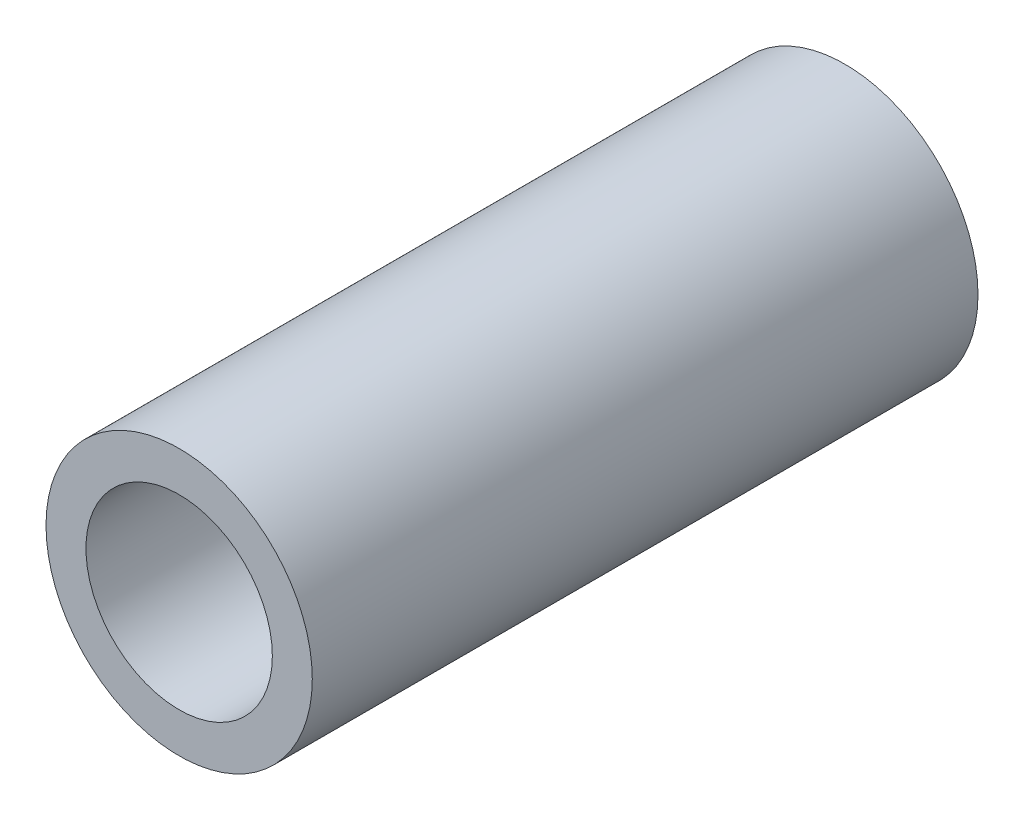
ISO-10303-21;
HEADER;
FILE_DESCRIPTION(('STEP AP214'),'2;1');
FILE_NAME('part.step','',(''),(''),'','','');
FILE_SCHEMA(('AUTOMOTIVE_DESIGN { 1 0 10303 214 1 1 1 1 }'));
ENDSEC;
DATA;
#1=APPLICATION_CONTEXT('core data for automotive mechanical design processes');
#2=APPLICATION_PROTOCOL_DEFINITION('international standard','automotive_design',2000,#1);
#3=PRODUCT_CONTEXT('',#1,'mechanical');
#4=PRODUCT('Part','Part','',(#3));
#5=PRODUCT_RELATED_PRODUCT_CATEGORY('part','',(#4));
#6=PRODUCT_DEFINITION_FORMATION('','',#4);
#7=PRODUCT_DEFINITION_CONTEXT('part definition',#1,'design');
#8=PRODUCT_DEFINITION('design','',#6,#7);
#9=PRODUCT_DEFINITION_SHAPE('','',#8);
#10=(LENGTH_UNIT() NAMED_UNIT(*) SI_UNIT(.MILLI.,.METRE.));
#11=(NAMED_UNIT(*) PLANE_ANGLE_UNIT() SI_UNIT($,.RADIAN.));
#12=(NAMED_UNIT(*) SI_UNIT($,.STERADIAN.) SOLID_ANGLE_UNIT());
#13=UNCERTAINTY_MEASURE_WITH_UNIT(LENGTH_MEASURE(1.E-05),#10,'distance_accuracy_value','');
#14=(GEOMETRIC_REPRESENTATION_CONTEXT(3) GLOBAL_UNCERTAINTY_ASSIGNED_CONTEXT((#13)) GLOBAL_UNIT_ASSIGNED_CONTEXT((#10,
#11,#12)) REPRESENTATION_CONTEXT('',''));
#15=CARTESIAN_POINT('',(0.,0.,0.));
#16=DIRECTION('',(0.,0.,1.));
#17=DIRECTION('',(1.,0.,0.));
#18=AXIS2_PLACEMENT_3D('',#15,#16,#17);
#19=CARTESIAN_POINT('',(0.,0.,10.));
#20=DIRECTION('',(0.,0.,1.));
#21=DIRECTION('',(1.,0.,0.));
#22=AXIS2_PLACEMENT_3D('',#19,#20,#21);
#23=PLANE('',#22);
#24=CARTESIAN_POINT('',(0.,0.,10.));
#25=DIRECTION('',(0.,0.,1.));
#26=DIRECTION('',(1.,0.,0.));
#27=AXIS2_PLACEMENT_3D('',#24,#25,#26);
#28=CIRCLE('',#27,2.);
#29=CARTESIAN_POINT('',(2.,0.,10.));
#30=VERTEX_POINT('',#29);
#31=EDGE_CURVE('E10',#30,#30,#28,.T.);
#32=ORIENTED_EDGE('',*,*,#31,.T.);
#33=EDGE_LOOP('',(#32));
#34=FACE_BOUND('',#33,.T.);
#35=CARTESIAN_POINT('',(0.,0.,10.));
#36=DIRECTION('',(0.,0.,1.));
#37=DIRECTION('',(1.,0.,0.));
#38=AXIS2_PLACEMENT_3D('',#35,#36,#37);
#39=CIRCLE('',#38,1.4);
#40=CARTESIAN_POINT('',(1.4,0.,10.));
#41=VERTEX_POINT('',#40);
#42=EDGE_CURVE('E49',#41,#41,#39,.T.);
#43=ORIENTED_EDGE('',*,*,#42,.F.);
#44=EDGE_LOOP('',(#43));
#45=FACE_BOUND('',#44,.T.);
#46=ADVANCED_FACE('F38',(#34,#45),#23,.T.);
#47=CARTESIAN_POINT('',(0.,0.,0.));
#48=DIRECTION('',(0.,0.,1.));
#49=DIRECTION('',(1.,0.,0.));
#50=AXIS2_PLACEMENT_3D('',#47,#48,#49);
#51=PLANE('',#50);
#52=CARTESIAN_POINT('',(0.,0.,0.));
#53=DIRECTION('',(0.,0.,1.));
#54=DIRECTION('',(1.,0.,0.));
#55=AXIS2_PLACEMENT_3D('',#52,#53,#54);
#56=CIRCLE('',#55,2.);
#57=CARTESIAN_POINT('',(2.,0.,0.));
#58=VERTEX_POINT('',#57);
#59=EDGE_CURVE('E42',#58,#58,#56,.T.);
#60=ORIENTED_EDGE('',*,*,#59,.F.);
#61=EDGE_LOOP('',(#60));
#62=FACE_BOUND('',#61,.T.);
#63=CARTESIAN_POINT('',(0.,0.,0.));
#64=DIRECTION('',(0.,0.,1.));
#65=DIRECTION('',(1.,0.,0.));
#66=AXIS2_PLACEMENT_3D('',#63,#64,#65);
#67=CIRCLE('',#66,1.4);
#68=CARTESIAN_POINT('',(1.4,0.,0.));
#69=VERTEX_POINT('',#68);
#70=EDGE_CURVE('E51',#69,#69,#67,.T.);
#71=ORIENTED_EDGE('',*,*,#70,.T.);
#72=EDGE_LOOP('',(#71));
#73=FACE_BOUND('',#72,.T.);
#74=ADVANCED_FACE('F61',(#62,#73),#51,.F.);
#75=CARTESIAN_POINT('',(0.,0.,10.));
#76=DIRECTION('',(0.,0.,-1.));
#77=DIRECTION('',(-1.,0.,0.));
#78=AXIS2_PLACEMENT_3D('',#75,#76,#77);
#79=CYLINDRICAL_SURFACE('',#78,2.);
#80=ORIENTED_EDGE('',*,*,#31,.F.);
#81=EDGE_LOOP('',(#80));
#82=FACE_BOUND('',#81,.T.);
#83=ORIENTED_EDGE('',*,*,#59,.T.);
#84=EDGE_LOOP('',(#83));
#85=FACE_BOUND('',#84,.T.);
#86=ADVANCED_FACE('F40',(#82,#85),#79,.T.);
#87=CARTESIAN_POINT('',(0.,0.,10.));
#88=DIRECTION('',(0.,0.,-1.));
#89=DIRECTION('',(-1.,0.,0.));
#90=AXIS2_PLACEMENT_3D('',#87,#88,#89);
#91=CYLINDRICAL_SURFACE('',#90,1.4);
#92=ORIENTED_EDGE('',*,*,#42,.T.);
#93=EDGE_LOOP('',(#92));
#94=FACE_BOUND('',#93,.T.);
#95=ORIENTED_EDGE('',*,*,#70,.F.);
#96=EDGE_LOOP('',(#95));
#97=FACE_BOUND('',#96,.T.);
#98=ADVANCED_FACE('F57',(#94,#97),#91,.F.);
#99=CLOSED_SHELL('',(#46,#74,#86,#98));
#100=MANIFOLD_SOLID_BREP('B2',#99);
#101=ADVANCED_BREP_SHAPE_REPRESENTATION('',(#18,#100),#14);
#102=SHAPE_DEFINITION_REPRESENTATION(#9,#101);
ENDSEC;
END-ISO-10303-21;
